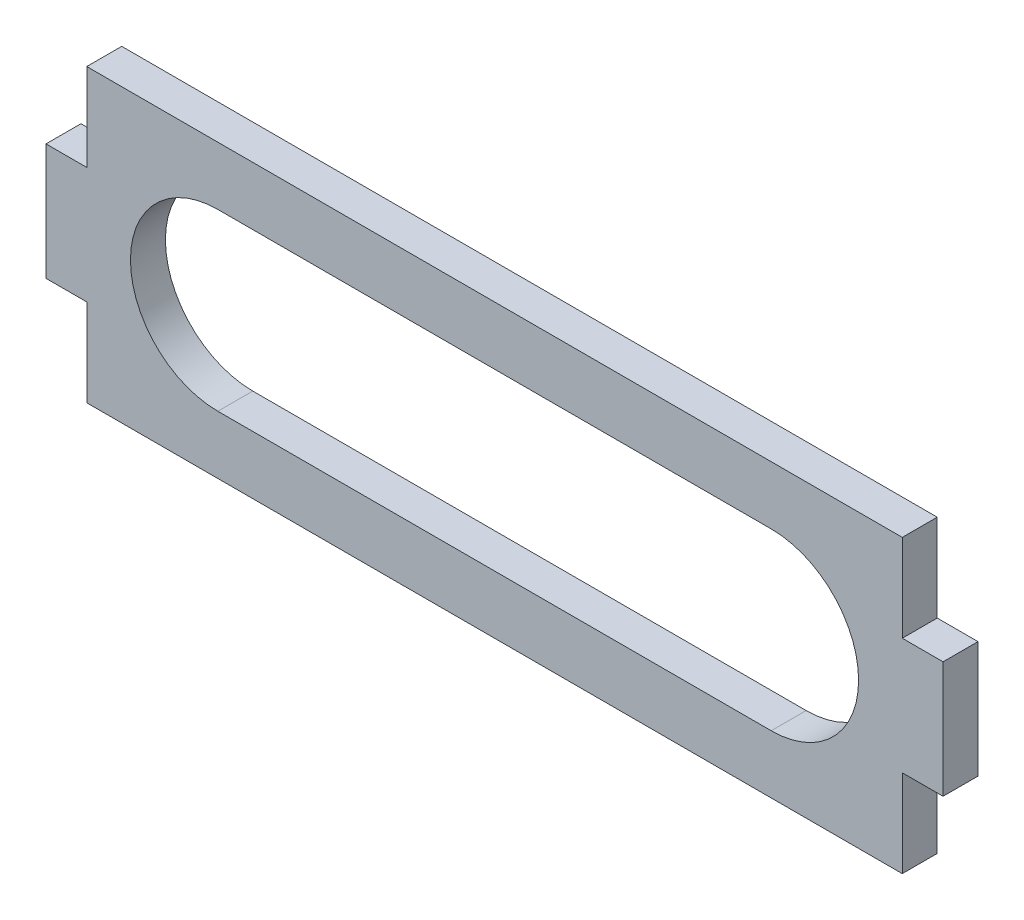
ISO-10303-21;
HEADER;
FILE_DESCRIPTION(('STEP AP214'),'2;1');
FILE_NAME('part.step','',(''),(''),'','','');
FILE_SCHEMA(('AUTOMOTIVE_DESIGN { 1 0 10303 214 1 1 1 1 }'));
ENDSEC;
DATA;
#1=APPLICATION_CONTEXT('core data for automotive mechanical design processes');
#2=APPLICATION_PROTOCOL_DEFINITION('international standard','automotive_design',2000,#1);
#3=PRODUCT_CONTEXT('',#1,'mechanical');
#4=PRODUCT('Part','Part','',(#3));
#5=PRODUCT_RELATED_PRODUCT_CATEGORY('part','',(#4));
#6=PRODUCT_DEFINITION_FORMATION('','',#4);
#7=PRODUCT_DEFINITION_CONTEXT('part definition',#1,'design');
#8=PRODUCT_DEFINITION('design','',#6,#7);
#9=PRODUCT_DEFINITION_SHAPE('','',#8);
#10=(LENGTH_UNIT() NAMED_UNIT(*) SI_UNIT(.MILLI.,.METRE.));
#11=(NAMED_UNIT(*) PLANE_ANGLE_UNIT() SI_UNIT($,.RADIAN.));
#12=(NAMED_UNIT(*) SI_UNIT($,.STERADIAN.) SOLID_ANGLE_UNIT());
#13=UNCERTAINTY_MEASURE_WITH_UNIT(LENGTH_MEASURE(1.E-05),#10,'distance_accuracy_value','');
#14=(GEOMETRIC_REPRESENTATION_CONTEXT(3) GLOBAL_UNCERTAINTY_ASSIGNED_CONTEXT((#13)) GLOBAL_UNIT_ASSIGNED_CONTEXT((#10,
#11,#12)) REPRESENTATION_CONTEXT('',''));
#15=CARTESIAN_POINT('',(0.,0.,0.));
#16=DIRECTION('',(0.,0.,1.));
#17=DIRECTION('',(1.,0.,0.));
#18=AXIS2_PLACEMENT_3D('',#15,#16,#17);
#19=CARTESIAN_POINT('',(0.,0.,6.));
#20=DIRECTION('',(0.,0.,1.));
#21=DIRECTION('',(1.,0.,0.));
#22=AXIS2_PLACEMENT_3D('',#19,#20,#21);
#23=PLANE('',#22);
#24=DIRECTION('',(0.,1.,0.));
#25=VECTOR('',#24,1.);
#26=CARTESIAN_POINT('',(140.,-14.9999999999999,6.));
#27=LINE('',#26,#25);
#28=CARTESIAN_POINT('',(140.,-14.9999999999999,6.));
#29=VERTEX_POINT('',#28);
#30=CARTESIAN_POINT('',(140.,0.,6.));
#31=VERTEX_POINT('',#30);
#32=EDGE_CURVE('E201',#29,#31,#27,.T.);
#33=ORIENTED_EDGE('',*,*,#32,.T.);
#34=DIRECTION('',(-1.,0.,0.));
#35=VECTOR('',#34,1.);
#36=CARTESIAN_POINT('',(140.,0.,6.));
#37=LINE('',#36,#35);
#38=CARTESIAN_POINT('',(0.,0.,6.));
#39=VERTEX_POINT('',#38);
#40=EDGE_CURVE('E205',#31,#39,#37,.T.);
#41=ORIENTED_EDGE('',*,*,#40,.T.);
#42=DIRECTION('',(0.,-1.,0.));
#43=VECTOR('',#42,1.);
#44=CARTESIAN_POINT('',(0.,0.,6.));
#45=LINE('',#44,#43);
#46=CARTESIAN_POINT('',(0.,-15.,6.));
#47=VERTEX_POINT('',#46);
#48=EDGE_CURVE('E209',#39,#47,#45,.T.);
#49=ORIENTED_EDGE('',*,*,#48,.T.);
#50=DIRECTION('',(-1.,0.,0.));
#51=VECTOR('',#50,1.);
#52=CARTESIAN_POINT('',(0.,-15.,6.));
#53=LINE('',#52,#51);
#54=CARTESIAN_POINT('',(-7.00000000000001,-15.,6.));
#55=VERTEX_POINT('',#54);
#56=EDGE_CURVE('E212',#47,#55,#53,.T.);
#57=ORIENTED_EDGE('',*,*,#56,.T.);
#58=DIRECTION('',(0.,-1.,0.));
#59=VECTOR('',#58,1.);
#60=CARTESIAN_POINT('',(-7.00000000000001,-15.,6.));
#61=LINE('',#60,#59);
#62=CARTESIAN_POINT('',(-7.00000000000001,-35.,6.));
#63=VERTEX_POINT('',#62);
#64=EDGE_CURVE('E215',#55,#63,#61,.T.);
#65=ORIENTED_EDGE('',*,*,#64,.T.);
#66=DIRECTION('',(1.,0.,0.));
#67=VECTOR('',#66,1.);
#68=CARTESIAN_POINT('',(-7.00000000000001,-35.,6.));
#69=LINE('',#68,#67);
#70=CARTESIAN_POINT('',(0.,-35.,6.));
#71=VERTEX_POINT('',#70);
#72=EDGE_CURVE('E218',#63,#71,#69,.T.);
#73=ORIENTED_EDGE('',*,*,#72,.T.);
#74=DIRECTION('',(0.,-1.,0.));
#75=VECTOR('',#74,1.);
#76=CARTESIAN_POINT('',(0.,-35.,6.));
#77=LINE('',#76,#75);
#78=CARTESIAN_POINT('',(0.,-50.,6.));
#79=VERTEX_POINT('',#78);
#80=EDGE_CURVE('E221',#71,#79,#77,.T.);
#81=ORIENTED_EDGE('',*,*,#80,.T.);
#82=DIRECTION('',(1.,0.,0.));
#83=VECTOR('',#82,1.);
#84=CARTESIAN_POINT('',(0.,-50.,6.));
#85=LINE('',#84,#83);
#86=CARTESIAN_POINT('',(140.,-50.,6.));
#87=VERTEX_POINT('',#86);
#88=EDGE_CURVE('E224',#79,#87,#85,.T.);
#89=ORIENTED_EDGE('',*,*,#88,.T.);
#90=DIRECTION('',(0.,1.,0.));
#91=VECTOR('',#90,1.);
#92=CARTESIAN_POINT('',(140.,-50.,6.));
#93=LINE('',#92,#91);
#94=CARTESIAN_POINT('',(140.,-35.,6.));
#95=VERTEX_POINT('',#94);
#96=EDGE_CURVE('E227',#87,#95,#93,.T.);
#97=ORIENTED_EDGE('',*,*,#96,.T.);
#98=DIRECTION('',(1.,0.,0.));
#99=VECTOR('',#98,1.);
#100=CARTESIAN_POINT('',(140.,-35.,6.));
#101=LINE('',#100,#99);
#102=CARTESIAN_POINT('',(147.,-35.,6.));
#103=VERTEX_POINT('',#102);
#104=EDGE_CURVE('E230',#95,#103,#101,.T.);
#105=ORIENTED_EDGE('',*,*,#104,.T.);
#106=DIRECTION('',(0.,1.,0.));
#107=VECTOR('',#106,1.);
#108=CARTESIAN_POINT('',(147.,-35.,6.));
#109=LINE('',#108,#107);
#110=CARTESIAN_POINT('',(147.,-14.9999999999999,6.));
#111=VERTEX_POINT('',#110);
#112=EDGE_CURVE('E233',#103,#111,#109,.T.);
#113=ORIENTED_EDGE('',*,*,#112,.T.);
#114=DIRECTION('',(-1.,0.,0.));
#115=VECTOR('',#114,1.);
#116=CARTESIAN_POINT('',(147.,-14.9999999999999,6.));
#117=LINE('',#116,#115);
#118=EDGE_CURVE('E236',#111,#29,#117,.T.);
#119=ORIENTED_EDGE('',*,*,#118,.T.);
#120=EDGE_LOOP('',(#33,#41,#49,#57,#65,#73,#81,#89,#97,#105,#113,#119));
#121=FACE_BOUND('',#120,.T.);
#122=DIRECTION('',(1.,0.,0.));
#123=VECTOR('',#122,1.);
#124=CARTESIAN_POINT('',(22.5,-40.,6.));
#125=LINE('',#124,#123);
#126=CARTESIAN_POINT('',(22.5,-40.,6.));
#127=VERTEX_POINT('',#126);
#128=CARTESIAN_POINT('',(117.5,-40.,6.));
#129=VERTEX_POINT('',#128);
#130=EDGE_CURVE('E162',#127,#129,#125,.T.);
#131=ORIENTED_EDGE('',*,*,#130,.F.);
#132=CARTESIAN_POINT('',(22.5,-25.,6.));
#133=DIRECTION('',(0.,0.,1.));
#134=DIRECTION('',(1.,0.,0.));
#135=AXIS2_PLACEMENT_3D('',#132,#133,#134);
#136=CIRCLE('',#135,15.);
#137=CARTESIAN_POINT('',(22.5,-9.99999999999999,6.));
#138=VERTEX_POINT('',#137);
#139=EDGE_CURVE('E153',#138,#127,#136,.T.);
#140=ORIENTED_EDGE('',*,*,#139,.F.);
#141=DIRECTION('',(-1.,0.,0.));
#142=VECTOR('',#141,1.);
#143=CARTESIAN_POINT('',(117.5,-9.99999999999999,6.));
#144=LINE('',#143,#142);
#145=CARTESIAN_POINT('',(117.5,-9.99999999999999,6.));
#146=VERTEX_POINT('',#145);
#147=EDGE_CURVE('E179',#146,#138,#144,.T.);
#148=ORIENTED_EDGE('',*,*,#147,.F.);
#149=CARTESIAN_POINT('',(117.5,-25.,6.));
#150=DIRECTION('',(0.,0.,1.));
#151=DIRECTION('',(1.,0.,0.));
#152=AXIS2_PLACEMENT_3D('',#149,#150,#151);
#153=CIRCLE('',#152,15.);
#154=EDGE_CURVE('E175',#129,#146,#153,.T.);
#155=ORIENTED_EDGE('',*,*,#154,.F.);
#156=EDGE_LOOP('',(#131,#140,#148,#155));
#157=FACE_BOUND('',#156,.T.);
#158=ADVANCED_FACE('F39',(#121,#157),#23,.T.);
#159=CARTESIAN_POINT('',(0.,0.,0.));
#160=DIRECTION('',(0.,0.,1.));
#161=DIRECTION('',(1.,0.,0.));
#162=AXIS2_PLACEMENT_3D('',#159,#160,#161);
#163=PLANE('',#162);
#164=DIRECTION('',(0.,1.,0.));
#165=VECTOR('',#164,1.);
#166=CARTESIAN_POINT('',(140.,-14.9999999999999,0.));
#167=LINE('',#166,#165);
#168=CARTESIAN_POINT('',(140.,-14.9999999999999,0.));
#169=VERTEX_POINT('',#168);
#170=CARTESIAN_POINT('',(140.,0.,0.));
#171=VERTEX_POINT('',#170);
#172=EDGE_CURVE('E171',#169,#171,#167,.T.);
#173=ORIENTED_EDGE('',*,*,#172,.F.);
#174=DIRECTION('',(-1.,0.,0.));
#175=VECTOR('',#174,1.);
#176=CARTESIAN_POINT('',(147.,-14.9999999999999,0.));
#177=LINE('',#176,#175);
#178=CARTESIAN_POINT('',(147.,-14.9999999999999,0.));
#179=VERTEX_POINT('',#178);
#180=EDGE_CURVE('E206',#179,#169,#177,.T.);
#181=ORIENTED_EDGE('',*,*,#180,.F.);
#182=DIRECTION('',(0.,1.,0.));
#183=VECTOR('',#182,1.);
#184=CARTESIAN_POINT('',(147.,-35.,0.));
#185=LINE('',#184,#183);
#186=CARTESIAN_POINT('',(147.,-35.,0.));
#187=VERTEX_POINT('',#186);
#188=EDGE_CURVE('E270',#187,#179,#185,.T.);
#189=ORIENTED_EDGE('',*,*,#188,.F.);
#190=DIRECTION('',(1.,0.,0.));
#191=VECTOR('',#190,1.);
#192=CARTESIAN_POINT('',(140.,-35.,0.));
#193=LINE('',#192,#191);
#194=CARTESIAN_POINT('',(140.,-35.,0.));
#195=VERTEX_POINT('',#194);
#196=EDGE_CURVE('E267',#195,#187,#193,.T.);
#197=ORIENTED_EDGE('',*,*,#196,.F.);
#198=DIRECTION('',(0.,1.,0.));
#199=VECTOR('',#198,1.);
#200=CARTESIAN_POINT('',(140.,-50.,0.));
#201=LINE('',#200,#199);
#202=CARTESIAN_POINT('',(140.,-50.,0.));
#203=VERTEX_POINT('',#202);
#204=EDGE_CURVE('E264',#203,#195,#201,.T.);
#205=ORIENTED_EDGE('',*,*,#204,.F.);
#206=DIRECTION('',(1.,0.,0.));
#207=VECTOR('',#206,1.);
#208=CARTESIAN_POINT('',(0.,-50.,0.));
#209=LINE('',#208,#207);
#210=CARTESIAN_POINT('',(0.,-50.,0.));
#211=VERTEX_POINT('',#210);
#212=EDGE_CURVE('E261',#211,#203,#209,.T.);
#213=ORIENTED_EDGE('',*,*,#212,.F.);
#214=DIRECTION('',(0.,-1.,0.));
#215=VECTOR('',#214,1.);
#216=CARTESIAN_POINT('',(0.,-35.,0.));
#217=LINE('',#216,#215);
#218=CARTESIAN_POINT('',(0.,-35.,0.));
#219=VERTEX_POINT('',#218);
#220=EDGE_CURVE('E258',#219,#211,#217,.T.);
#221=ORIENTED_EDGE('',*,*,#220,.F.);
#222=DIRECTION('',(1.,0.,0.));
#223=VECTOR('',#222,1.);
#224=CARTESIAN_POINT('',(-7.00000000000001,-35.,0.));
#225=LINE('',#224,#223);
#226=CARTESIAN_POINT('',(-7.00000000000001,-35.,0.));
#227=VERTEX_POINT('',#226);
#228=EDGE_CURVE('E255',#227,#219,#225,.T.);
#229=ORIENTED_EDGE('',*,*,#228,.F.);
#230=DIRECTION('',(0.,-1.,0.));
#231=VECTOR('',#230,1.);
#232=CARTESIAN_POINT('',(-7.00000000000001,-15.,0.));
#233=LINE('',#232,#231);
#234=CARTESIAN_POINT('',(-7.00000000000001,-15.,0.));
#235=VERTEX_POINT('',#234);
#236=EDGE_CURVE('E252',#235,#227,#233,.T.);
#237=ORIENTED_EDGE('',*,*,#236,.F.);
#238=DIRECTION('',(-1.,0.,0.));
#239=VECTOR('',#238,1.);
#240=CARTESIAN_POINT('',(0.,-15.,0.));
#241=LINE('',#240,#239);
#242=CARTESIAN_POINT('',(0.,-15.,0.));
#243=VERTEX_POINT('',#242);
#244=EDGE_CURVE('E249',#243,#235,#241,.T.);
#245=ORIENTED_EDGE('',*,*,#244,.F.);
#246=DIRECTION('',(0.,-1.,0.));
#247=VECTOR('',#246,1.);
#248=CARTESIAN_POINT('',(0.,0.,0.));
#249=LINE('',#248,#247);
#250=CARTESIAN_POINT('',(0.,0.,0.));
#251=VERTEX_POINT('',#250);
#252=EDGE_CURVE('E246',#251,#243,#249,.T.);
#253=ORIENTED_EDGE('',*,*,#252,.F.);
#254=DIRECTION('',(-1.,0.,0.));
#255=VECTOR('',#254,1.);
#256=CARTESIAN_POINT('',(140.,0.,0.));
#257=LINE('',#256,#255);
#258=EDGE_CURVE('E243',#171,#251,#257,.T.);
#259=ORIENTED_EDGE('',*,*,#258,.F.);
#260=EDGE_LOOP('',(#173,#181,#189,#197,#205,#213,#221,#229,#237,#245,#253,#259));
#261=FACE_BOUND('',#260,.T.);
#262=CARTESIAN_POINT('',(22.5,-25.,0.));
#263=DIRECTION('',(0.,0.,1.));
#264=DIRECTION('',(1.,0.,0.));
#265=AXIS2_PLACEMENT_3D('',#262,#263,#264);
#266=CIRCLE('',#265,15.);
#267=CARTESIAN_POINT('',(22.5,-9.99999999999999,0.));
#268=VERTEX_POINT('',#267);
#269=CARTESIAN_POINT('',(22.5,-40.,0.));
#270=VERTEX_POINT('',#269);
#271=EDGE_CURVE('E63',#268,#270,#266,.T.);
#272=ORIENTED_EDGE('',*,*,#271,.T.);
#273=DIRECTION('',(1.,0.,0.));
#274=VECTOR('',#273,1.);
#275=CARTESIAN_POINT('',(22.5,-40.,0.));
#276=LINE('',#275,#274);
#277=CARTESIAN_POINT('',(117.5,-40.,0.));
#278=VERTEX_POINT('',#277);
#279=EDGE_CURVE('E169',#270,#278,#276,.T.);
#280=ORIENTED_EDGE('',*,*,#279,.T.);
#281=CARTESIAN_POINT('',(117.5,-25.,0.));
#282=DIRECTION('',(0.,0.,1.));
#283=DIRECTION('',(1.,0.,0.));
#284=AXIS2_PLACEMENT_3D('',#281,#282,#283);
#285=CIRCLE('',#284,15.);
#286=CARTESIAN_POINT('',(117.5,-9.99999999999999,0.));
#287=VERTEX_POINT('',#286);
#288=EDGE_CURVE('E188',#278,#287,#285,.T.);
#289=ORIENTED_EDGE('',*,*,#288,.T.);
#290=DIRECTION('',(-1.,0.,0.));
#291=VECTOR('',#290,1.);
#292=CARTESIAN_POINT('',(117.5,-9.99999999999999,0.));
#293=LINE('',#292,#291);
#294=EDGE_CURVE('E163',#287,#268,#293,.T.);
#295=ORIENTED_EDGE('',*,*,#294,.T.);
#296=EDGE_LOOP('',(#272,#280,#289,#295));
#297=FACE_BOUND('',#296,.T.);
#298=ADVANCED_FACE('F325',(#261,#297),#163,.F.);
#299=CARTESIAN_POINT('',(140.,-14.9999999999999,6.));
#300=DIRECTION('',(-1.,0.,0.));
#301=DIRECTION('',(0.,0.,1.));
#302=AXIS2_PLACEMENT_3D('',#299,#300,#301);
#303=PLANE('',#302);
#304=ORIENTED_EDGE('',*,*,#172,.T.);
#305=DIRECTION('',(0.,0.,-1.));
#306=VECTOR('',#305,1.);
#307=CARTESIAN_POINT('',(140.,0.,6.));
#308=LINE('',#307,#306);
#309=EDGE_CURVE('E11',#31,#171,#308,.T.);
#310=ORIENTED_EDGE('',*,*,#309,.F.);
#311=ORIENTED_EDGE('',*,*,#32,.F.);
#312=DIRECTION('',(0.,0.,-1.));
#313=VECTOR('',#312,1.);
#314=CARTESIAN_POINT('',(140.,-14.9999999999999,6.));
#315=LINE('',#314,#313);
#316=EDGE_CURVE('E239',#29,#169,#315,.T.);
#317=ORIENTED_EDGE('',*,*,#316,.T.);
#318=EDGE_LOOP('',(#304,#310,#311,#317));
#319=FACE_BOUND('',#318,.T.);
#320=ADVANCED_FACE('F41',(#319),#303,.F.);
#321=CARTESIAN_POINT('',(140.,0.,6.));
#322=DIRECTION('',(0.,-1.,0.));
#323=DIRECTION('',(0.,0.,-1.));
#324=AXIS2_PLACEMENT_3D('',#321,#322,#323);
#325=PLANE('',#324);
#326=ORIENTED_EDGE('',*,*,#258,.T.);
#327=DIRECTION('',(0.,0.,-1.));
#328=VECTOR('',#327,1.);
#329=CARTESIAN_POINT('',(0.,0.,6.));
#330=LINE('',#329,#328);
#331=EDGE_CURVE('E48',#39,#251,#330,.T.);
#332=ORIENTED_EDGE('',*,*,#331,.F.);
#333=ORIENTED_EDGE('',*,*,#40,.F.);
#334=ORIENTED_EDGE('',*,*,#309,.T.);
#335=EDGE_LOOP('',(#326,#332,#333,#334));
#336=FACE_BOUND('',#335,.T.);
#337=ADVANCED_FACE('F342',(#336),#325,.F.);
#338=CARTESIAN_POINT('',(0.,0.,6.));
#339=DIRECTION('',(1.,0.,0.));
#340=DIRECTION('',(0.,0.,-1.));
#341=AXIS2_PLACEMENT_3D('',#338,#339,#340);
#342=PLANE('',#341);
#343=ORIENTED_EDGE('',*,*,#252,.T.);
#344=DIRECTION('',(0.,0.,-1.));
#345=VECTOR('',#344,1.);
#346=CARTESIAN_POINT('',(0.,-15.,6.));
#347=LINE('',#346,#345);
#348=EDGE_CURVE('E310',#47,#243,#347,.T.);
#349=ORIENTED_EDGE('',*,*,#348,.F.);
#350=ORIENTED_EDGE('',*,*,#48,.F.);
#351=ORIENTED_EDGE('',*,*,#331,.T.);
#352=EDGE_LOOP('',(#343,#349,#350,#351));
#353=FACE_BOUND('',#352,.T.);
#354=ADVANCED_FACE('F319',(#353),#342,.F.);
#355=CARTESIAN_POINT('',(0.,-15.,6.));
#356=DIRECTION('',(0.,-1.,0.));
#357=DIRECTION('',(0.,0.,-1.));
#358=AXIS2_PLACEMENT_3D('',#355,#356,#357);
#359=PLANE('',#358);
#360=ORIENTED_EDGE('',*,*,#244,.T.);
#361=DIRECTION('',(0.,0.,-1.));
#362=VECTOR('',#361,1.);
#363=CARTESIAN_POINT('',(-7.00000000000001,-15.,6.));
#364=LINE('',#363,#362);
#365=EDGE_CURVE('E306',#55,#235,#364,.T.);
#366=ORIENTED_EDGE('',*,*,#365,.F.);
#367=ORIENTED_EDGE('',*,*,#56,.F.);
#368=ORIENTED_EDGE('',*,*,#348,.T.);
#369=EDGE_LOOP('',(#360,#366,#367,#368));
#370=FACE_BOUND('',#369,.T.);
#371=ADVANCED_FACE('F331',(#370),#359,.F.);
#372=CARTESIAN_POINT('',(-7.00000000000001,-15.,6.));
#373=DIRECTION('',(1.,0.,0.));
#374=DIRECTION('',(0.,0.,-1.));
#375=AXIS2_PLACEMENT_3D('',#372,#373,#374);
#376=PLANE('',#375);
#377=ORIENTED_EDGE('',*,*,#236,.T.);
#378=DIRECTION('',(0.,0.,-1.));
#379=VECTOR('',#378,1.);
#380=CARTESIAN_POINT('',(-7.00000000000001,-35.,6.));
#381=LINE('',#380,#379);
#382=EDGE_CURVE('E302',#63,#227,#381,.T.);
#383=ORIENTED_EDGE('',*,*,#382,.F.);
#384=ORIENTED_EDGE('',*,*,#64,.F.);
#385=ORIENTED_EDGE('',*,*,#365,.T.);
#386=EDGE_LOOP('',(#377,#383,#384,#385));
#387=FACE_BOUND('',#386,.T.);
#388=ADVANCED_FACE('F335',(#387),#376,.F.);
#389=CARTESIAN_POINT('',(-7.00000000000001,-35.,6.));
#390=DIRECTION('',(0.,1.,0.));
#391=DIRECTION('',(0.,0.,1.));
#392=AXIS2_PLACEMENT_3D('',#389,#390,#391);
#393=PLANE('',#392);
#394=ORIENTED_EDGE('',*,*,#228,.T.);
#395=DIRECTION('',(0.,0.,-1.));
#396=VECTOR('',#395,1.);
#397=CARTESIAN_POINT('',(0.,-35.,6.));
#398=LINE('',#397,#396);
#399=EDGE_CURVE('E298',#71,#219,#398,.T.);
#400=ORIENTED_EDGE('',*,*,#399,.F.);
#401=ORIENTED_EDGE('',*,*,#72,.F.);
#402=ORIENTED_EDGE('',*,*,#382,.T.);
#403=EDGE_LOOP('',(#394,#400,#401,#402));
#404=FACE_BOUND('',#403,.T.);
#405=ADVANCED_FACE('F375',(#404),#393,.F.);
#406=CARTESIAN_POINT('',(0.,-35.,6.));
#407=DIRECTION('',(1.,0.,0.));
#408=DIRECTION('',(0.,0.,-1.));
#409=AXIS2_PLACEMENT_3D('',#406,#407,#408);
#410=PLANE('',#409);
#411=ORIENTED_EDGE('',*,*,#220,.T.);
#412=DIRECTION('',(0.,0.,-1.));
#413=VECTOR('',#412,1.);
#414=CARTESIAN_POINT('',(0.,-50.,6.));
#415=LINE('',#414,#413);
#416=EDGE_CURVE('E294',#79,#211,#415,.T.);
#417=ORIENTED_EDGE('',*,*,#416,.F.);
#418=ORIENTED_EDGE('',*,*,#80,.F.);
#419=ORIENTED_EDGE('',*,*,#399,.T.);
#420=EDGE_LOOP('',(#411,#417,#418,#419));
#421=FACE_BOUND('',#420,.T.);
#422=ADVANCED_FACE('F373',(#421),#410,.F.);
#423=CARTESIAN_POINT('',(0.,-50.,6.));
#424=DIRECTION('',(0.,1.,0.));
#425=DIRECTION('',(0.,0.,1.));
#426=AXIS2_PLACEMENT_3D('',#423,#424,#425);
#427=PLANE('',#426);
#428=ORIENTED_EDGE('',*,*,#212,.T.);
#429=DIRECTION('',(0.,0.,-1.));
#430=VECTOR('',#429,1.);
#431=CARTESIAN_POINT('',(140.,-50.,6.));
#432=LINE('',#431,#430);
#433=EDGE_CURVE('E290',#87,#203,#432,.T.);
#434=ORIENTED_EDGE('',*,*,#433,.F.);
#435=ORIENTED_EDGE('',*,*,#88,.F.);
#436=ORIENTED_EDGE('',*,*,#416,.T.);
#437=EDGE_LOOP('',(#428,#434,#435,#436));
#438=FACE_BOUND('',#437,.T.);
#439=ADVANCED_FACE('F369',(#438),#427,.F.);
#440=CARTESIAN_POINT('',(140.,-50.,6.));
#441=DIRECTION('',(-1.,0.,0.));
#442=DIRECTION('',(0.,0.,1.));
#443=AXIS2_PLACEMENT_3D('',#440,#441,#442);
#444=PLANE('',#443);
#445=ORIENTED_EDGE('',*,*,#204,.T.);
#446=DIRECTION('',(0.,0.,-1.));
#447=VECTOR('',#446,1.);
#448=CARTESIAN_POINT('',(140.,-35.,6.));
#449=LINE('',#448,#447);
#450=EDGE_CURVE('E286',#95,#195,#449,.T.);
#451=ORIENTED_EDGE('',*,*,#450,.F.);
#452=ORIENTED_EDGE('',*,*,#96,.F.);
#453=ORIENTED_EDGE('',*,*,#433,.T.);
#454=EDGE_LOOP('',(#445,#451,#452,#453));
#455=FACE_BOUND('',#454,.T.);
#456=ADVANCED_FACE('F364',(#455),#444,.F.);
#457=CARTESIAN_POINT('',(140.,-35.,6.));
#458=DIRECTION('',(0.,1.,0.));
#459=DIRECTION('',(0.,0.,1.));
#460=AXIS2_PLACEMENT_3D('',#457,#458,#459);
#461=PLANE('',#460);
#462=ORIENTED_EDGE('',*,*,#196,.T.);
#463=DIRECTION('',(0.,0.,-1.));
#464=VECTOR('',#463,1.);
#465=CARTESIAN_POINT('',(147.,-35.,6.));
#466=LINE('',#465,#464);
#467=EDGE_CURVE('E282',#103,#187,#466,.T.);
#468=ORIENTED_EDGE('',*,*,#467,.F.);
#469=ORIENTED_EDGE('',*,*,#104,.F.);
#470=ORIENTED_EDGE('',*,*,#450,.T.);
#471=EDGE_LOOP('',(#462,#468,#469,#470));
#472=FACE_BOUND('',#471,.T.);
#473=ADVANCED_FACE('F358',(#472),#461,.F.);
#474=CARTESIAN_POINT('',(147.,-35.,6.));
#475=DIRECTION('',(-1.,0.,0.));
#476=DIRECTION('',(0.,0.,1.));
#477=AXIS2_PLACEMENT_3D('',#474,#475,#476);
#478=PLANE('',#477);
#479=ORIENTED_EDGE('',*,*,#188,.T.);
#480=DIRECTION('',(0.,0.,-1.));
#481=VECTOR('',#480,1.);
#482=CARTESIAN_POINT('',(147.,-14.9999999999999,6.));
#483=LINE('',#482,#481);
#484=EDGE_CURVE('E278',#111,#179,#483,.T.);
#485=ORIENTED_EDGE('',*,*,#484,.F.);
#486=ORIENTED_EDGE('',*,*,#112,.F.);
#487=ORIENTED_EDGE('',*,*,#467,.T.);
#488=EDGE_LOOP('',(#479,#485,#486,#487));
#489=FACE_BOUND('',#488,.T.);
#490=ADVANCED_FACE('F354',(#489),#478,.F.);
#491=CARTESIAN_POINT('',(147.,-14.9999999999999,6.));
#492=DIRECTION('',(0.,-1.,0.));
#493=DIRECTION('',(0.,0.,-1.));
#494=AXIS2_PLACEMENT_3D('',#491,#492,#493);
#495=PLANE('',#494);
#496=ORIENTED_EDGE('',*,*,#180,.T.);
#497=ORIENTED_EDGE('',*,*,#316,.F.);
#498=ORIENTED_EDGE('',*,*,#118,.F.);
#499=ORIENTED_EDGE('',*,*,#484,.T.);
#500=EDGE_LOOP('',(#496,#497,#498,#499));
#501=FACE_BOUND('',#500,.T.);
#502=ADVANCED_FACE('F349',(#501),#495,.F.);
#503=CARTESIAN_POINT('',(22.5,-25.,6.));
#504=DIRECTION('',(0.,0.,-1.));
#505=DIRECTION('',(-1.,0.,0.));
#506=AXIS2_PLACEMENT_3D('',#503,#504,#505);
#507=CYLINDRICAL_SURFACE('',#506,15.);
#508=ORIENTED_EDGE('',*,*,#271,.F.);
#509=DIRECTION('',(0.,0.,-1.));
#510=VECTOR('',#509,1.);
#511=CARTESIAN_POINT('',(22.5,-9.99999999999999,6.));
#512=LINE('',#511,#510);
#513=EDGE_CURVE('E157',#138,#268,#512,.T.);
#514=ORIENTED_EDGE('',*,*,#513,.F.);
#515=ORIENTED_EDGE('',*,*,#139,.T.);
#516=DIRECTION('',(0.,0.,-1.));
#517=VECTOR('',#516,1.);
#518=CARTESIAN_POINT('',(22.5,-40.,6.));
#519=LINE('',#518,#517);
#520=EDGE_CURVE('E156',#127,#270,#519,.T.);
#521=ORIENTED_EDGE('',*,*,#520,.T.);
#522=EDGE_LOOP('',(#508,#514,#515,#521));
#523=FACE_BOUND('',#522,.T.);
#524=ADVANCED_FACE('F155',(#523),#507,.F.);
#525=CARTESIAN_POINT('',(22.5,-40.,6.));
#526=DIRECTION('',(0.,1.,0.));
#527=DIRECTION('',(-1.,0.,0.));
#528=AXIS2_PLACEMENT_3D('',#525,#526,#527);
#529=PLANE('',#528);
#530=ORIENTED_EDGE('',*,*,#279,.F.);
#531=ORIENTED_EDGE('',*,*,#520,.F.);
#532=ORIENTED_EDGE('',*,*,#130,.T.);
#533=DIRECTION('',(0.,0.,-1.));
#534=VECTOR('',#533,1.);
#535=CARTESIAN_POINT('',(117.5,-40.,6.));
#536=LINE('',#535,#534);
#537=EDGE_CURVE('E172',#129,#278,#536,.T.);
#538=ORIENTED_EDGE('',*,*,#537,.T.);
#539=EDGE_LOOP('',(#530,#531,#532,#538));
#540=FACE_BOUND('',#539,.T.);
#541=ADVANCED_FACE('F166',(#540),#529,.T.);
#542=CARTESIAN_POINT('',(117.5,-25.,6.));
#543=DIRECTION('',(0.,0.,-1.));
#544=DIRECTION('',(-1.,0.,0.));
#545=AXIS2_PLACEMENT_3D('',#542,#543,#544);
#546=CYLINDRICAL_SURFACE('',#545,15.);
#547=ORIENTED_EDGE('',*,*,#288,.F.);
#548=ORIENTED_EDGE('',*,*,#537,.F.);
#549=ORIENTED_EDGE('',*,*,#154,.T.);
#550=DIRECTION('',(0.,0.,-1.));
#551=VECTOR('',#550,1.);
#552=CARTESIAN_POINT('',(117.5,-9.99999999999999,6.));
#553=LINE('',#552,#551);
#554=EDGE_CURVE('E55',#146,#287,#553,.T.);
#555=ORIENTED_EDGE('',*,*,#554,.T.);
#556=EDGE_LOOP('',(#547,#548,#549,#555));
#557=FACE_BOUND('',#556,.T.);
#558=ADVANCED_FACE('F433',(#557),#546,.F.);
#559=CARTESIAN_POINT('',(117.5,-9.99999999999999,6.));
#560=DIRECTION('',(0.,-1.,0.));
#561=DIRECTION('',(1.,0.,0.));
#562=AXIS2_PLACEMENT_3D('',#559,#560,#561);
#563=PLANE('',#562);
#564=ORIENTED_EDGE('',*,*,#294,.F.);
#565=ORIENTED_EDGE('',*,*,#554,.F.);
#566=ORIENTED_EDGE('',*,*,#147,.T.);
#567=ORIENTED_EDGE('',*,*,#513,.T.);
#568=EDGE_LOOP('',(#564,#565,#566,#567));
#569=FACE_BOUND('',#568,.T.);
#570=ADVANCED_FACE('F439',(#569),#563,.T.);
#571=CLOSED_SHELL('',(#158,#298,#320,#337,#354,#371,#388,#405,#422,#439,#456,#473,#490,#502,
#524,#541,#558,#570));
#572=MANIFOLD_SOLID_BREP('B2',#571);
#573=ADVANCED_BREP_SHAPE_REPRESENTATION('',(#18,#572),#14);
#574=SHAPE_DEFINITION_REPRESENTATION(#9,#573);
ENDSEC;
END-ISO-10303-21;
